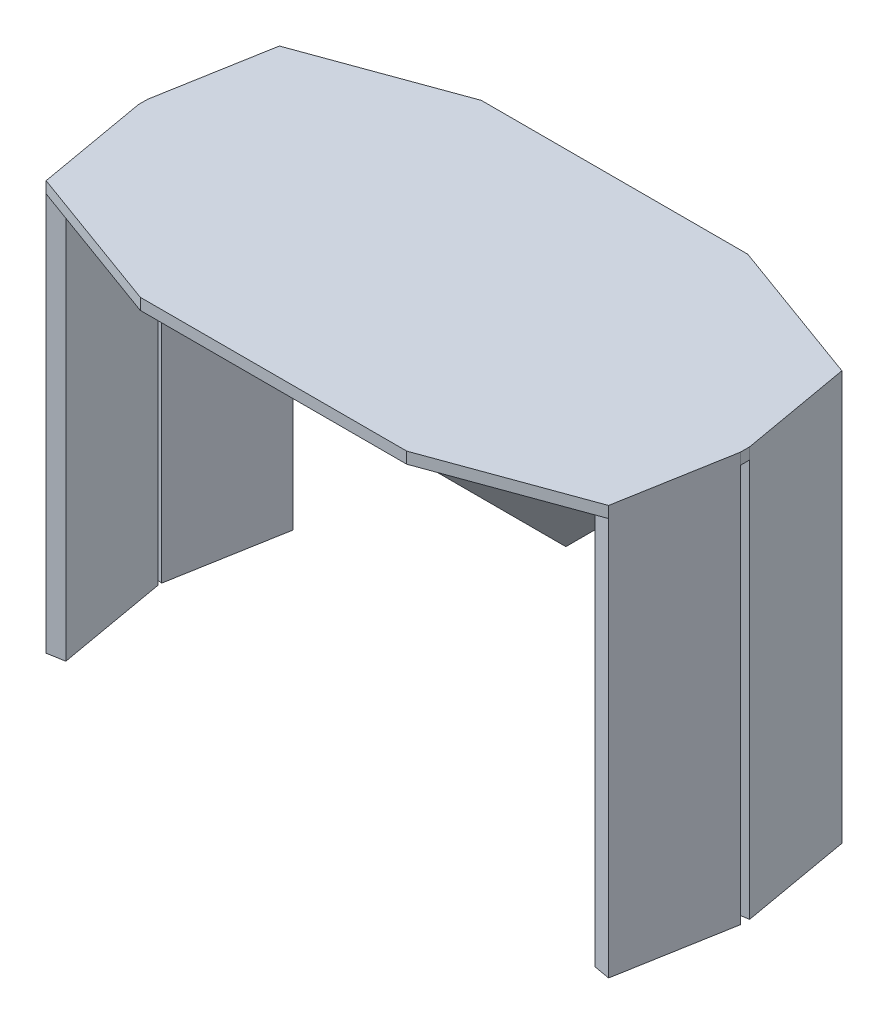
ISO-10303-21;
HEADER;
FILE_DESCRIPTION(('STEP AP214'),'2;1');
FILE_NAME('part.step','',(''),(''),'','','');
FILE_SCHEMA(('AUTOMOTIVE_DESIGN { 1 0 10303 214 1 1 1 1 }'));
ENDSEC;
DATA;
#1=APPLICATION_CONTEXT('core data for automotive mechanical design processes');
#2=APPLICATION_PROTOCOL_DEFINITION('international standard','automotive_design',2000,#1);
#3=PRODUCT_CONTEXT('',#1,'mechanical');
#4=PRODUCT('Part','Part','',(#3));
#5=PRODUCT_RELATED_PRODUCT_CATEGORY('part','',(#4));
#6=PRODUCT_DEFINITION_FORMATION('','',#4);
#7=PRODUCT_DEFINITION_CONTEXT('part definition',#1,'design');
#8=PRODUCT_DEFINITION('design','',#6,#7);
#9=PRODUCT_DEFINITION_SHAPE('','',#8);
#10=(LENGTH_UNIT() NAMED_UNIT(*) SI_UNIT(.MILLI.,.METRE.));
#11=(NAMED_UNIT(*) PLANE_ANGLE_UNIT() SI_UNIT($,.RADIAN.));
#12=(NAMED_UNIT(*) SI_UNIT($,.STERADIAN.) SOLID_ANGLE_UNIT());
#13=UNCERTAINTY_MEASURE_WITH_UNIT(LENGTH_MEASURE(1.E-05),#10,'distance_accuracy_value','');
#14=(GEOMETRIC_REPRESENTATION_CONTEXT(3) GLOBAL_UNCERTAINTY_ASSIGNED_CONTEXT((#13)) GLOBAL_UNIT_ASSIGNED_CONTEXT((#10,
#11,#12)) REPRESENTATION_CONTEXT('',''));
#15=CARTESIAN_POINT('',(0.,0.,0.));
#16=DIRECTION('',(0.,0.,1.));
#17=DIRECTION('',(1.,0.,0.));
#18=AXIS2_PLACEMENT_3D('',#15,#16,#17);
#19=CARTESIAN_POINT('',(3.47296355333847,-41.437039865158,-20.));
#20=DIRECTION('',(0.984807753012209,0.,0.173648177666924));
#21=DIRECTION('',(0.173648177666924,0.,-0.984807753012209));
#22=AXIS2_PLACEMENT_3D('',#19,#20,#21);
#23=PLANE('',#22);
#24=DIRECTION('',(0.,1.,0.));
#25=VECTOR('',#24,1.);
#26=CARTESIAN_POINT('',(3.47296355333847,-41.437039865158,-20.));
#27=LINE('',#26,#25);
#28=CARTESIAN_POINT('',(3.47296355333847,-41.437039865158,-20.));
#29=VERTEX_POINT('',#28);
#30=CARTESIAN_POINT('',(3.47296355333847,28.562960134842,-20.));
#31=VERTEX_POINT('',#30);
#32=EDGE_CURVE('E49',#29,#31,#27,.T.);
#33=ORIENTED_EDGE('',*,*,#32,.T.);
#34=DIRECTION('',(0.100623686125547,0.814994484643548,-0.570665281746756));
#35=VECTOR('',#34,1.);
#36=CARTESIAN_POINT('',(0.959479024496279,8.20516857384306,-5.74532088768638));
#37=LINE('',#36,#35);
#38=CARTESIAN_POINT('',(3.09129529284178,25.4716648420002,-17.8354517331199));
#39=VERTEX_POINT('',#38);
#40=EDGE_CURVE('E436',#39,#31,#37,.T.);
#41=ORIENTED_EDGE('',*,*,#40,.F.);
#42=DIRECTION('',(-0.171087869746029,0.171087869746031,0.970287525247816));
#43=VECTOR('',#42,1.);
#44=CARTESIAN_POINT('',(0.836068096298262,27.7268920385437,-5.04542273425472));
#45=LINE('',#44,#43);
#46=CARTESIAN_POINT('',(0.,28.562960134842,-0.303844939755816));
#47=VERTEX_POINT('',#46);
#48=EDGE_CURVE('E552',#39,#47,#45,.T.);
#49=ORIENTED_EDGE('',*,*,#48,.T.);
#50=DIRECTION('',(0.,1.,0.));
#51=VECTOR('',#50,1.);
#52=CARTESIAN_POINT('',(0.,-41.437039865158,-0.303844939755821));
#53=LINE('',#52,#51);
#54=CARTESIAN_POINT('',(0.,-41.437039865158,-0.303844939755821));
#55=VERTEX_POINT('',#54);
#56=EDGE_CURVE('E11',#55,#47,#53,.T.);
#57=ORIENTED_EDGE('',*,*,#56,.F.);
#58=DIRECTION('',(0.173648177666924,0.,-0.984807753012209));
#59=VECTOR('',#58,1.);
#60=CARTESIAN_POINT('',(3.47296355333847,-41.437039865158,-20.));
#61=LINE('',#60,#59);
#62=EDGE_CURVE('E411',#55,#29,#61,.T.);
#63=ORIENTED_EDGE('',*,*,#62,.T.);
#64=EDGE_LOOP('',(#33,#41,#49,#57,#63));
#65=FACE_BOUND('',#64,.T.);
#66=ADVANCED_FACE('F46',(#65),#23,.T.);
#67=CARTESIAN_POINT('',(0.,28.562960134842,0.));
#68=DIRECTION('',(0.,-1.,0.));
#69=DIRECTION('',(0.,0.,-1.));
#70=AXIS2_PLACEMENT_3D('',#67,#68,#69);
#71=PLANE('',#70);
#72=DIRECTION('',(0.984807753012209,0.,-0.173648177666924));
#73=VECTOR('',#72,1.);
#74=CARTESIAN_POINT('',(3.47296355333847,28.562960134842,20.));
#75=LINE('',#74,#73);
#76=CARTESIAN_POINT('',(0.518540294301844,28.562960134842,20.5209445330008));
#77=VERTEX_POINT('',#76);
#78=CARTESIAN_POINT('',(3.47296355333847,28.562960134842,20.));
#79=VERTEX_POINT('',#78);
#80=EDGE_CURVE('E513',#77,#79,#75,.T.);
#81=ORIENTED_EDGE('',*,*,#80,.T.);
#82=DIRECTION('',(-1.,0.,0.));
#83=VECTOR('',#82,1.);
#84=CARTESIAN_POINT('',(100.,28.562960134842,20.));
#85=LINE('',#84,#83);
#86=CARTESIAN_POINT('',(96.5270364466614,28.562960134842,20.));
#87=VERTEX_POINT('',#86);
#88=EDGE_CURVE('E261',#87,#79,#85,.T.);
#89=ORIENTED_EDGE('',*,*,#88,.F.);
#90=DIRECTION('',(0.984807753012209,0.,0.173648177666923));
#91=VECTOR('',#90,1.);
#92=CARTESIAN_POINT('',(96.5270364466614,28.562960134842,20.));
#93=LINE('',#92,#91);
#94=CARTESIAN_POINT('',(99.481459705698,28.562960134842,20.5209445330008));
#95=VERTEX_POINT('',#94);
#96=EDGE_CURVE('E473',#87,#95,#93,.T.);
#97=ORIENTED_EDGE('',*,*,#96,.T.);
#98=DIRECTION('',(0.93969262078591,0.,-0.342020143325663));
#99=VECTOR('',#98,1.);
#100=CARTESIAN_POINT('',(99.481459705698,28.562960134842,20.5209445330008));
#101=LINE('',#100,#99);
#102=CARTESIAN_POINT('',(73.4379688523593,28.562960134842,30.));
#103=VERTEX_POINT('',#102);
#104=EDGE_CURVE('E350',#103,#95,#101,.T.);
#105=ORIENTED_EDGE('',*,*,#104,.F.);
#106=DIRECTION('',(1.,0.,0.));
#107=VECTOR('',#106,1.);
#108=CARTESIAN_POINT('',(73.4379688523593,28.562960134842,30.));
#109=LINE('',#108,#107);
#110=CARTESIAN_POINT('',(26.5620311476406,28.562960134842,30.));
#111=VERTEX_POINT('',#110);
#112=EDGE_CURVE('E347',#111,#103,#109,.T.);
#113=ORIENTED_EDGE('',*,*,#112,.F.);
#114=DIRECTION('',(0.93969262078591,0.,0.342020143325663));
#115=VECTOR('',#114,1.);
#116=CARTESIAN_POINT('',(26.5620311476406,28.562960134842,30.));
#117=LINE('',#116,#115);
#118=EDGE_CURVE('E344',#77,#111,#117,.T.);
#119=ORIENTED_EDGE('',*,*,#118,.F.);
#120=EDGE_LOOP('',(#81,#89,#97,#105,#113,#119));
#121=FACE_BOUND('',#120,.T.);
#122=ADVANCED_FACE('F608',(#121),#71,.T.);
#123=DIRECTION('',(-0.984807753012209,0.,0.173648177666923));
#124=VECTOR('',#123,1.);
#125=CARTESIAN_POINT('',(96.5270364466614,28.562960134842,-20.));
#126=LINE('',#125,#124);
#127=CARTESIAN_POINT('',(99.481459705698,28.562960134842,-20.5209445330008));
#128=VERTEX_POINT('',#127);
#129=CARTESIAN_POINT('',(96.5270364466614,28.562960134842,-20.));
#130=VERTEX_POINT('',#129);
#131=EDGE_CURVE('E279',#128,#130,#126,.T.);
#132=ORIENTED_EDGE('',*,*,#131,.T.);
#133=DIRECTION('',(-1.,0.,0.));
#134=VECTOR('',#133,1.);
#135=CARTESIAN_POINT('',(100.,28.562960134842,-20.));
#136=LINE('',#135,#134);
#137=EDGE_CURVE('E443',#130,#31,#136,.T.);
#138=ORIENTED_EDGE('',*,*,#137,.T.);
#139=DIRECTION('',(-0.984807753012209,0.,-0.173648177666924));
#140=VECTOR('',#139,1.);
#141=CARTESIAN_POINT('',(3.47296355333847,28.562960134842,-20.));
#142=LINE('',#141,#140);
#143=CARTESIAN_POINT('',(0.518540294301844,28.562960134842,-20.5209445330008));
#144=VERTEX_POINT('',#143);
#145=EDGE_CURVE('E410',#31,#144,#142,.T.);
#146=ORIENTED_EDGE('',*,*,#145,.T.);
#147=DIRECTION('',(-0.93969262078591,0.,0.342020143325663));
#148=VECTOR('',#147,1.);
#149=CARTESIAN_POINT('',(0.518540294301844,28.562960134842,-20.5209445330008));
#150=LINE('',#149,#148);
#151=CARTESIAN_POINT('',(26.5620311476406,28.562960134842,-30.));
#152=VERTEX_POINT('',#151);
#153=EDGE_CURVE('E307',#152,#144,#150,.T.);
#154=ORIENTED_EDGE('',*,*,#153,.F.);
#155=DIRECTION('',(-1.,0.,0.));
#156=VECTOR('',#155,1.);
#157=CARTESIAN_POINT('',(26.5620311476406,28.562960134842,-30.));
#158=LINE('',#157,#156);
#159=CARTESIAN_POINT('',(73.4379688523592,28.562960134842,-30.));
#160=VERTEX_POINT('',#159);
#161=EDGE_CURVE('E360',#160,#152,#158,.T.);
#162=ORIENTED_EDGE('',*,*,#161,.F.);
#163=DIRECTION('',(-0.939692620785911,0.,-0.342020143325663));
#164=VECTOR('',#163,1.);
#165=CARTESIAN_POINT('',(73.4379688523592,28.562960134842,-30.));
#166=LINE('',#165,#164);
#167=EDGE_CURVE('E357',#128,#160,#166,.T.);
#168=ORIENTED_EDGE('',*,*,#167,.F.);
#169=EDGE_LOOP('',(#132,#138,#146,#154,#162,#168));
#170=FACE_BOUND('',#169,.T.);
#171=ADVANCED_FACE('F441',(#170),#71,.T.);
#172=DIRECTION('',(-0.984807753012209,0.,-0.173648177666924));
#173=VECTOR('',#172,1.);
#174=CARTESIAN_POINT('',(102.954423259036,28.562960134842,0.824789472756611));
#175=LINE('',#174,#173);
#176=CARTESIAN_POINT('',(102.954423259036,28.562960134842,0.824789472756611));
#177=VERTEX_POINT('',#176);
#178=CARTESIAN_POINT('',(100.,28.562960134842,0.303844939755861));
#179=VERTEX_POINT('',#178);
#180=EDGE_CURVE('E258',#177,#179,#175,.T.);
#181=ORIENTED_EDGE('',*,*,#180,.T.);
#182=DIRECTION('',(0.,0.,1.));
#183=VECTOR('',#182,1.);
#184=CARTESIAN_POINT('',(100.,28.562960134842,-20.));
#185=LINE('',#184,#183);
#186=CARTESIAN_POINT('',(100.,28.562960134842,-0.303844939755851));
#187=VERTEX_POINT('',#186);
#188=EDGE_CURVE('E239',#187,#179,#185,.T.);
#189=ORIENTED_EDGE('',*,*,#188,.F.);
#190=DIRECTION('',(0.984807753012209,0.,-0.173648177666924));
#191=VECTOR('',#190,1.);
#192=CARTESIAN_POINT('',(102.954423259036,28.562960134842,-0.824789472756596));
#193=LINE('',#192,#191);
#194=CARTESIAN_POINT('',(102.954423259036,28.562960134842,-0.824789472756596));
#195=VERTEX_POINT('',#194);
#196=EDGE_CURVE('E255',#187,#195,#193,.T.);
#197=ORIENTED_EDGE('',*,*,#196,.T.);
#198=DIRECTION('',(0.,0.,-1.));
#199=VECTOR('',#198,1.);
#200=CARTESIAN_POINT('',(102.954423259036,28.562960134842,-0.824789472756596));
#201=LINE('',#200,#199);
#202=EDGE_CURVE('E354',#177,#195,#201,.T.);
#203=ORIENTED_EDGE('',*,*,#202,.F.);
#204=EDGE_LOOP('',(#181,#189,#197,#203));
#205=FACE_BOUND('',#204,.T.);
#206=ADVANCED_FACE('F252',(#205),#71,.T.);
#207=DIRECTION('',(0.984807753012209,0.,0.173648177666924));
#208=VECTOR('',#207,1.);
#209=CARTESIAN_POINT('',(-2.95442325903662,28.562960134842,-0.824789472756583));
#210=LINE('',#209,#208);
#211=CARTESIAN_POINT('',(-2.95442325903662,28.562960134842,-0.824789472756583));
#212=VERTEX_POINT('',#211);
#213=EDGE_CURVE('E415',#212,#47,#210,.T.);
#214=ORIENTED_EDGE('',*,*,#213,.T.);
#215=DIRECTION('',(0.,0.,1.));
#216=VECTOR('',#215,1.);
#217=CARTESIAN_POINT('',(0.,28.562960134842,-20.));
#218=LINE('',#217,#216);
#219=CARTESIAN_POINT('',(0.,28.562960134842,0.303844939755803));
#220=VERTEX_POINT('',#219);
#221=EDGE_CURVE('E262',#47,#220,#218,.T.);
#222=ORIENTED_EDGE('',*,*,#221,.T.);
#223=DIRECTION('',(-0.984807753012209,0.,0.173648177666924));
#224=VECTOR('',#223,1.);
#225=CARTESIAN_POINT('',(-2.95442325903662,28.562960134842,0.824789472756598));
#226=LINE('',#225,#224);
#227=CARTESIAN_POINT('',(-2.95442325903662,28.562960134842,0.824789472756598));
#228=VERTEX_POINT('',#227);
#229=EDGE_CURVE('E517',#220,#228,#226,.T.);
#230=ORIENTED_EDGE('',*,*,#229,.T.);
#231=DIRECTION('',(0.,0.,1.));
#232=VECTOR('',#231,1.);
#233=CARTESIAN_POINT('',(-2.95442325903662,28.562960134842,-0.824789472756583));
#234=LINE('',#233,#232);
#235=EDGE_CURVE('E285',#212,#228,#234,.T.);
#236=ORIENTED_EDGE('',*,*,#235,.F.);
#237=EDGE_LOOP('',(#214,#222,#230,#236));
#238=FACE_BOUND('',#237,.T.);
#239=ADVANCED_FACE('F650',(#238),#71,.T.);
#240=CARTESIAN_POINT('',(96.5270364466614,-41.437039865158,-20.));
#241=DIRECTION('',(-0.984807753012209,0.,0.173648177666924));
#242=DIRECTION('',(0.173648177666924,0.,0.984807753012209));
#243=AXIS2_PLACEMENT_3D('',#240,#241,#242);
#244=PLANE('',#243);
#245=DIRECTION('',(-0.171087869746037,-0.171087869746039,-0.970287525247813));
#246=VECTOR('',#245,1.);
#247=CARTESIAN_POINT('',(95.7926256720428,24.3555858068847,-24.1650504742258));
#248=LINE('',#247,#246);
#249=CARTESIAN_POINT('',(96.9087047071581,25.4716648420001,-17.8354517331199));
#250=VERTEX_POINT('',#249);
#251=EDGE_CURVE('E236',#187,#250,#248,.T.);
#252=ORIENTED_EDGE('',*,*,#251,.T.);
#253=DIRECTION('',(0.100623686125552,-0.814994484643548,0.570665281746756));
#254=VECTOR('',#253,1.);
#255=CARTESIAN_POINT('',(100.053033596453,0.00439365216062918,-0.00307646836314397));
#256=LINE('',#255,#254);
#257=EDGE_CURVE('E572',#130,#250,#256,.T.);
#258=ORIENTED_EDGE('',*,*,#257,.F.);
#259=DIRECTION('',(0.,1.,0.));
#260=VECTOR('',#259,1.);
#261=CARTESIAN_POINT('',(96.5270364466614,-41.437039865158,-20.));
#262=LINE('',#261,#260);
#263=CARTESIAN_POINT('',(96.5270364466614,-41.437039865158,-20.));
#264=VERTEX_POINT('',#263);
#265=EDGE_CURVE('E273',#264,#130,#262,.T.);
#266=ORIENTED_EDGE('',*,*,#265,.F.);
#267=DIRECTION('',(0.173648177666924,0.,0.984807753012209));
#268=VECTOR('',#267,1.);
#269=CARTESIAN_POINT('',(96.5270364466614,-41.437039865158,-20.));
#270=LINE('',#269,#268);
#271=CARTESIAN_POINT('',(99.9999999999998,-41.437039865158,-0.303844939755833));
#272=VERTEX_POINT('',#271);
#273=EDGE_CURVE('E268',#264,#272,#270,.T.);
#274=ORIENTED_EDGE('',*,*,#273,.T.);
#275=DIRECTION('',(0.,1.,0.));
#276=VECTOR('',#275,1.);
#277=CARTESIAN_POINT('',(99.9999999999998,-41.437039865158,-0.303844939755833));
#278=LINE('',#277,#276);
#279=EDGE_CURVE('E265',#272,#187,#278,.T.);
#280=ORIENTED_EDGE('',*,*,#279,.T.);
#281=EDGE_LOOP('',(#252,#258,#266,#274,#280));
#282=FACE_BOUND('',#281,.T.);
#283=ADVANCED_FACE('F266',(#282),#244,.T.);
#284=CARTESIAN_POINT('',(96.5270364466614,-41.437039865158,20.));
#285=DIRECTION('',(-0.984807753012209,0.,-0.173648177666924));
#286=DIRECTION('',(-0.173648177666924,0.,0.984807753012209));
#287=AXIS2_PLACEMENT_3D('',#284,#285,#286);
#288=PLANE('',#287);
#289=DIRECTION('',(0.,1.,0.));
#290=VECTOR('',#289,1.);
#291=CARTESIAN_POINT('',(96.5270364466614,-41.437039865158,20.));
#292=LINE('',#291,#290);
#293=CARTESIAN_POINT('',(96.5270364466614,-41.437039865158,20.));
#294=VERTEX_POINT('',#293);
#295=EDGE_CURVE('E498',#294,#87,#292,.T.);
#296=ORIENTED_EDGE('',*,*,#295,.T.);
#297=DIRECTION('',(-0.100623686125552,0.814994484643548,0.570665281746756));
#298=VECTOR('',#297,1.);
#299=CARTESIAN_POINT('',(96.5622006409599,28.2781502107206,19.8005739441733));
#300=LINE('',#299,#298);
#301=CARTESIAN_POINT('',(96.9087047071581,25.471664842,17.8354517331199));
#302=VERTEX_POINT('',#301);
#303=EDGE_CURVE('E569',#302,#87,#300,.T.);
#304=ORIENTED_EDGE('',*,*,#303,.F.);
#305=DIRECTION('',(0.171087869746037,0.171087869746039,-0.970287525247813));
#306=VECTOR('',#305,1.);
#307=CARTESIAN_POINT('',(95.7926256720428,24.3555858068847,24.1650504742258));
#308=LINE('',#307,#306);
#309=EDGE_CURVE('E555',#302,#179,#308,.T.);
#310=ORIENTED_EDGE('',*,*,#309,.T.);
#311=DIRECTION('',(0.,1.,0.));
#312=VECTOR('',#311,1.);
#313=CARTESIAN_POINT('',(99.9999999999998,-41.437039865158,0.303844939755832));
#314=LINE('',#313,#312);
#315=CARTESIAN_POINT('',(99.9999999999998,-41.437039865158,0.303844939755832));
#316=VERTEX_POINT('',#315);
#317=EDGE_CURVE('E510',#316,#179,#314,.T.);
#318=ORIENTED_EDGE('',*,*,#317,.F.);
#319=DIRECTION('',(-0.173648177666924,0.,0.984807753012209));
#320=VECTOR('',#319,1.);
#321=CARTESIAN_POINT('',(96.5270364466614,-41.437039865158,20.));
#322=LINE('',#321,#320);
#323=EDGE_CURVE('E478',#316,#294,#322,.T.);
#324=ORIENTED_EDGE('',*,*,#323,.T.);
#325=EDGE_LOOP('',(#296,#304,#310,#318,#324));
#326=FACE_BOUND('',#325,.T.);
#327=ADVANCED_FACE('F600',(#326),#288,.T.);
#328=CARTESIAN_POINT('',(3.47296355333847,-41.437039865158,20.));
#329=DIRECTION('',(0.984807753012209,0.,-0.173648177666924));
#330=DIRECTION('',(-0.173648177666924,0.,-0.984807753012209));
#331=AXIS2_PLACEMENT_3D('',#328,#329,#330);
#332=PLANE('',#331);
#333=DIRECTION('',(0.171087869746029,-0.171087869746031,0.970287525247816));
#334=VECTOR('',#333,1.);
#335=CARTESIAN_POINT('',(0.83606809629826,27.7268920385437,5.04542273425473));
#336=LINE('',#335,#334);
#337=CARTESIAN_POINT('',(3.09129529284178,25.4716648420002,17.83545173312));
#338=VERTEX_POINT('',#337);
#339=EDGE_CURVE('E579',#220,#338,#336,.T.);
#340=ORIENTED_EDGE('',*,*,#339,.T.);
#341=DIRECTION('',(-0.100623686125547,-0.814994484643548,-0.570665281746756));
#342=VECTOR('',#341,1.);
#343=CARTESIAN_POINT('',(4.4503119799892,36.4789251324031,25.5428183634965));
#344=LINE('',#343,#342);
#345=EDGE_CURVE('E63',#79,#338,#344,.T.);
#346=ORIENTED_EDGE('',*,*,#345,.F.);
#347=DIRECTION('',(0.,1.,0.));
#348=VECTOR('',#347,1.);
#349=CARTESIAN_POINT('',(3.47296355333847,-41.437039865158,20.));
#350=LINE('',#349,#348);
#351=CARTESIAN_POINT('',(3.47296355333847,-41.437039865158,20.));
#352=VERTEX_POINT('',#351);
#353=EDGE_CURVE('E536',#352,#79,#350,.T.);
#354=ORIENTED_EDGE('',*,*,#353,.F.);
#355=DIRECTION('',(-0.173648177666924,0.,-0.984807753012209));
#356=VECTOR('',#355,1.);
#357=CARTESIAN_POINT('',(3.47296355333847,-41.437039865158,20.));
#358=LINE('',#357,#356);
#359=CARTESIAN_POINT('',(0.,-41.437039865158,0.30384493975582));
#360=VERTEX_POINT('',#359);
#361=EDGE_CURVE('E524',#352,#360,#358,.T.);
#362=ORIENTED_EDGE('',*,*,#361,.T.);
#363=DIRECTION('',(0.,1.,0.));
#364=VECTOR('',#363,1.);
#365=CARTESIAN_POINT('',(0.,-41.437039865158,0.30384493975582));
#366=LINE('',#365,#364);
#367=EDGE_CURVE('E540',#360,#220,#366,.T.);
#368=ORIENTED_EDGE('',*,*,#367,.T.);
#369=EDGE_LOOP('',(#340,#346,#354,#362,#368));
#370=FACE_BOUND('',#369,.T.);
#371=ADVANCED_FACE('F640',(#370),#332,.T.);
#372=CARTESIAN_POINT('',(-2.95442325903662,-41.437039865158,-0.824789472756591));
#373=DIRECTION('',(-0.173648177666924,0.,0.984807753012209));
#374=DIRECTION('',(0.984807753012209,0.,0.173648177666924));
#375=AXIS2_PLACEMENT_3D('',#372,#373,#374);
#376=PLANE('',#375);
#377=ORIENTED_EDGE('',*,*,#213,.F.);
#378=DIRECTION('',(0.,1.,0.));
#379=VECTOR('',#378,1.);
#380=CARTESIAN_POINT('',(-2.95442325903662,-41.437039865158,-0.824789472756591));
#381=LINE('',#380,#379);
#382=CARTESIAN_POINT('',(-2.95442325903662,-41.437039865158,-0.824789472756591));
#383=VERTEX_POINT('',#382);
#384=EDGE_CURVE('E55',#383,#212,#381,.T.);
#385=ORIENTED_EDGE('',*,*,#384,.F.);
#386=DIRECTION('',(0.984807753012209,0.,0.173648177666924));
#387=VECTOR('',#386,1.);
#388=CARTESIAN_POINT('',(-2.95442325903662,-41.437039865158,-0.824789472756591));
#389=LINE('',#388,#387);
#390=EDGE_CURVE('E421',#383,#55,#389,.T.);
#391=ORIENTED_EDGE('',*,*,#390,.T.);
#392=ORIENTED_EDGE('',*,*,#56,.T.);
#393=EDGE_LOOP('',(#377,#385,#391,#392));
#394=FACE_BOUND('',#393,.T.);
#395=ADVANCED_FACE('F653',(#394),#376,.T.);
#396=CARTESIAN_POINT('',(0.518540294301844,-41.437039865158,-20.5209445330008));
#397=DIRECTION('',(-0.984807753012209,0.,-0.173648177666923));
#398=DIRECTION('',(-0.173648177666923,0.,0.984807753012209));
#399=AXIS2_PLACEMENT_3D('',#396,#397,#398);
#400=PLANE('',#399);
#401=ORIENTED_EDGE('',*,*,#384,.T.);
#402=DIRECTION('',(0.,-1.,0.));
#403=VECTOR('',#402,1.);
#404=CARTESIAN_POINT('',(-2.95442325903662,30.562960134842,-0.824789472756582));
#405=LINE('',#404,#403);
#406=CARTESIAN_POINT('',(-2.95442325903662,30.562960134842,-0.824789472756582));
#407=VERTEX_POINT('',#406);
#408=EDGE_CURVE('E406',#407,#212,#405,.T.);
#409=ORIENTED_EDGE('',*,*,#408,.F.);
#410=DIRECTION('',(-0.173648177666923,0.,0.984807753012209));
#411=VECTOR('',#410,1.);
#412=CARTESIAN_POINT('',(0.518540294301844,30.562960134842,-20.5209445330008));
#413=LINE('',#412,#411);
#414=CARTESIAN_POINT('',(0.518540294301844,30.562960134842,-20.5209445330008));
#415=VERTEX_POINT('',#414);
#416=EDGE_CURVE('E302',#415,#407,#413,.T.);
#417=ORIENTED_EDGE('',*,*,#416,.F.);
#418=DIRECTION('',(0.,-1.,0.));
#419=VECTOR('',#418,1.);
#420=CARTESIAN_POINT('',(0.518540294301844,30.562960134842,-20.5209445330008));
#421=LINE('',#420,#419);
#422=EDGE_CURVE('E340',#415,#144,#421,.T.);
#423=ORIENTED_EDGE('',*,*,#422,.T.);
#424=DIRECTION('',(0.,1.,0.));
#425=VECTOR('',#424,1.);
#426=CARTESIAN_POINT('',(0.518540294301844,-41.437039865158,-20.5209445330008));
#427=LINE('',#426,#425);
#428=CARTESIAN_POINT('',(0.518540294301844,-41.437039865158,-20.5209445330008));
#429=VERTEX_POINT('',#428);
#430=EDGE_CURVE('E432',#429,#144,#427,.T.);
#431=ORIENTED_EDGE('',*,*,#430,.F.);
#432=DIRECTION('',(-0.173648177666923,0.,0.984807753012209));
#433=VECTOR('',#432,1.);
#434=CARTESIAN_POINT('',(0.518540294301844,-41.437039865158,-20.5209445330008));
#435=LINE('',#434,#433);
#436=EDGE_CURVE('E418',#429,#383,#435,.T.);
#437=ORIENTED_EDGE('',*,*,#436,.T.);
#438=EDGE_LOOP('',(#401,#409,#417,#423,#431,#437));
#439=FACE_BOUND('',#438,.T.);
#440=ADVANCED_FACE('F450',(#439),#400,.T.);
#441=CARTESIAN_POINT('',(3.47296355333847,-41.437039865158,-20.));
#442=DIRECTION('',(0.173648177666924,0.,-0.984807753012209));
#443=DIRECTION('',(-0.984807753012209,0.,-0.173648177666924));
#444=AXIS2_PLACEMENT_3D('',#441,#442,#443);
#445=PLANE('',#444);
#446=ORIENTED_EDGE('',*,*,#145,.F.);
#447=ORIENTED_EDGE('',*,*,#32,.F.);
#448=DIRECTION('',(-0.984807753012209,0.,-0.173648177666924));
#449=VECTOR('',#448,1.);
#450=CARTESIAN_POINT('',(3.47296355333847,-41.437039865158,-20.));
#451=LINE('',#450,#449);
#452=EDGE_CURVE('E414',#29,#429,#451,.T.);
#453=ORIENTED_EDGE('',*,*,#452,.T.);
#454=ORIENTED_EDGE('',*,*,#430,.T.);
#455=EDGE_LOOP('',(#446,#447,#453,#454));
#456=FACE_BOUND('',#455,.T.);
#457=ADVANCED_FACE('F437',(#456),#445,.T.);
#458=CARTESIAN_POINT('',(0.,-41.437039865158,0.));
#459=DIRECTION('',(0.,1.,0.));
#460=DIRECTION('',(0.,0.,1.));
#461=AXIS2_PLACEMENT_3D('',#458,#459,#460);
#462=PLANE('',#461);
#463=ORIENTED_EDGE('',*,*,#62,.F.);
#464=ORIENTED_EDGE('',*,*,#390,.F.);
#465=ORIENTED_EDGE('',*,*,#436,.F.);
#466=ORIENTED_EDGE('',*,*,#452,.F.);
#467=EDGE_LOOP('',(#463,#464,#465,#466));
#468=FACE_BOUND('',#467,.T.);
#469=ADVANCED_FACE('F656',(#468),#462,.F.);
#470=CARTESIAN_POINT('',(-2.95442325903662,30.562960134842,-0.824789472756582));
#471=DIRECTION('',(1.,0.,0.));
#472=DIRECTION('',(0.,0.,-1.));
#473=AXIS2_PLACEMENT_3D('',#470,#471,#472);
#474=PLANE('',#473);
#475=ORIENTED_EDGE('',*,*,#235,.T.);
#476=DIRECTION('',(0.,-1.,0.));
#477=VECTOR('',#476,1.);
#478=CARTESIAN_POINT('',(-2.95442325903662,30.562960134842,0.824789472756598));
#479=LINE('',#478,#477);
#480=CARTESIAN_POINT('',(-2.95442325903662,30.562960134842,0.824789472756598));
#481=VERTEX_POINT('',#480);
#482=EDGE_CURVE('E402',#481,#228,#479,.T.);
#483=ORIENTED_EDGE('',*,*,#482,.F.);
#484=DIRECTION('',(0.,0.,1.));
#485=VECTOR('',#484,1.);
#486=CARTESIAN_POINT('',(-2.95442325903662,30.562960134842,-0.824789472756582));
#487=LINE('',#486,#485);
#488=EDGE_CURVE('E306',#407,#481,#487,.T.);
#489=ORIENTED_EDGE('',*,*,#488,.F.);
#490=ORIENTED_EDGE('',*,*,#408,.T.);
#491=EDGE_LOOP('',(#475,#483,#489,#490));
#492=FACE_BOUND('',#491,.T.);
#493=ADVANCED_FACE('F658',(#492),#474,.F.);
#494=CARTESIAN_POINT('',(-2.95442325903662,30.562960134842,0.824789472756598));
#495=DIRECTION('',(0.984807753012209,0.,-0.173648177666923));
#496=DIRECTION('',(-0.173648177666923,0.,-0.984807753012209));
#497=AXIS2_PLACEMENT_3D('',#494,#495,#496);
#498=PLANE('',#497);
#499=ORIENTED_EDGE('',*,*,#482,.T.);
#500=DIRECTION('',(0.,1.,0.));
#501=VECTOR('',#500,1.);
#502=CARTESIAN_POINT('',(-2.95442325903662,-41.437039865158,0.82478947275659));
#503=LINE('',#502,#501);
#504=CARTESIAN_POINT('',(-2.95442325903662,-41.437039865158,0.82478947275659));
#505=VERTEX_POINT('',#504);
#506=EDGE_CURVE('E544',#505,#228,#503,.T.);
#507=ORIENTED_EDGE('',*,*,#506,.F.);
#508=DIRECTION('',(0.173648177666923,0.,0.984807753012209));
#509=VECTOR('',#508,1.);
#510=CARTESIAN_POINT('',(0.518540294301844,-41.437039865158,20.5209445330008));
#511=LINE('',#510,#509);
#512=CARTESIAN_POINT('',(0.518540294301844,-41.437039865158,20.5209445330008));
#513=VERTEX_POINT('',#512);
#514=EDGE_CURVE('E532',#505,#513,#511,.T.);
#515=ORIENTED_EDGE('',*,*,#514,.T.);
#516=DIRECTION('',(0.,1.,0.));
#517=VECTOR('',#516,1.);
#518=CARTESIAN_POINT('',(0.518540294301844,-41.437039865158,20.5209445330008));
#519=LINE('',#518,#517);
#520=EDGE_CURVE('E548',#513,#77,#519,.T.);
#521=ORIENTED_EDGE('',*,*,#520,.T.);
#522=DIRECTION('',(0.,-1.,0.));
#523=VECTOR('',#522,1.);
#524=CARTESIAN_POINT('',(0.518540294301844,30.562960134842,20.5209445330008));
#525=LINE('',#524,#523);
#526=CARTESIAN_POINT('',(0.518540294301844,30.562960134842,20.5209445330008));
#527=VERTEX_POINT('',#526);
#528=EDGE_CURVE('E399',#527,#77,#525,.T.);
#529=ORIENTED_EDGE('',*,*,#528,.F.);
#530=DIRECTION('',(0.173648177666923,0.,0.984807753012209));
#531=VECTOR('',#530,1.);
#532=CARTESIAN_POINT('',(-2.95442325903662,30.562960134842,0.824789472756598));
#533=LINE('',#532,#531);
#534=EDGE_CURVE('E310',#481,#527,#533,.T.);
#535=ORIENTED_EDGE('',*,*,#534,.F.);
#536=EDGE_LOOP('',(#499,#507,#515,#521,#529,#535));
#537=FACE_BOUND('',#536,.T.);
#538=ADVANCED_FACE('F632',(#537),#498,.F.);
#539=CARTESIAN_POINT('',(26.5620311476406,30.562960134842,30.));
#540=DIRECTION('',(0.342020143325663,0.,-0.939692620785911));
#541=DIRECTION('',(-0.939692620785911,0.,-0.342020143325663));
#542=AXIS2_PLACEMENT_3D('',#539,#540,#541);
#543=PLANE('',#542);
#544=ORIENTED_EDGE('',*,*,#118,.T.);
#545=DIRECTION('',(0.,-1.,0.));
#546=VECTOR('',#545,1.);
#547=CARTESIAN_POINT('',(26.5620311476406,30.562960134842,30.));
#548=LINE('',#547,#546);
#549=CARTESIAN_POINT('',(26.5620311476406,30.562960134842,30.));
#550=VERTEX_POINT('',#549);
#551=EDGE_CURVE('E395',#550,#111,#548,.T.);
#552=ORIENTED_EDGE('',*,*,#551,.F.);
#553=DIRECTION('',(0.93969262078591,0.,0.342020143325663));
#554=VECTOR('',#553,1.);
#555=CARTESIAN_POINT('',(26.5620311476406,30.562960134842,30.));
#556=LINE('',#555,#554);
#557=EDGE_CURVE('E313',#527,#550,#556,.T.);
#558=ORIENTED_EDGE('',*,*,#557,.F.);
#559=ORIENTED_EDGE('',*,*,#528,.T.);
#560=EDGE_LOOP('',(#544,#552,#558,#559));
#561=FACE_BOUND('',#560,.T.);
#562=ADVANCED_FACE('F729',(#561),#543,.F.);
#563=CARTESIAN_POINT('',(73.4379688523593,30.562960134842,30.));
#564=DIRECTION('',(0.,0.,-1.));
#565=DIRECTION('',(0.,1.,0.));
#566=AXIS2_PLACEMENT_3D('',#563,#564,#565);
#567=PLANE('',#566);
#568=ORIENTED_EDGE('',*,*,#112,.T.);
#569=DIRECTION('',(0.,-1.,0.));
#570=VECTOR('',#569,1.);
#571=CARTESIAN_POINT('',(73.4379688523593,30.562960134842,30.));
#572=LINE('',#571,#570);
#573=CARTESIAN_POINT('',(73.4379688523593,30.562960134842,30.));
#574=VERTEX_POINT('',#573);
#575=EDGE_CURVE('E391',#574,#103,#572,.T.);
#576=ORIENTED_EDGE('',*,*,#575,.F.);
#577=DIRECTION('',(1.,0.,0.));
#578=VECTOR('',#577,1.);
#579=CARTESIAN_POINT('',(73.4379688523593,30.562960134842,30.));
#580=LINE('',#579,#578);
#581=EDGE_CURVE('E316',#550,#574,#580,.T.);
#582=ORIENTED_EDGE('',*,*,#581,.F.);
#583=ORIENTED_EDGE('',*,*,#551,.T.);
#584=EDGE_LOOP('',(#568,#576,#582,#583));
#585=FACE_BOUND('',#584,.T.);
#586=ADVANCED_FACE('F626',(#585),#567,.F.);
#587=CARTESIAN_POINT('',(99.481459705698,30.562960134842,20.5209445330008));
#588=DIRECTION('',(-0.342020143325663,0.,-0.93969262078591));
#589=DIRECTION('',(-0.93969262078591,0.,0.342020143325663));
#590=AXIS2_PLACEMENT_3D('',#587,#588,#589);
#591=PLANE('',#590);
#592=ORIENTED_EDGE('',*,*,#104,.T.);
#593=DIRECTION('',(0.,-1.,0.));
#594=VECTOR('',#593,1.);
#595=CARTESIAN_POINT('',(99.481459705698,30.562960134842,20.5209445330008));
#596=LINE('',#595,#594);
#597=CARTESIAN_POINT('',(99.481459705698,30.562960134842,20.5209445330008));
#598=VERTEX_POINT('',#597);
#599=EDGE_CURVE('E387',#598,#95,#596,.T.);
#600=ORIENTED_EDGE('',*,*,#599,.F.);
#601=DIRECTION('',(0.93969262078591,0.,-0.342020143325663));
#602=VECTOR('',#601,1.);
#603=CARTESIAN_POINT('',(99.481459705698,30.562960134842,20.5209445330008));
#604=LINE('',#603,#602);
#605=EDGE_CURVE('E319',#574,#598,#604,.T.);
#606=ORIENTED_EDGE('',*,*,#605,.F.);
#607=ORIENTED_EDGE('',*,*,#575,.T.);
#608=EDGE_LOOP('',(#592,#600,#606,#607));
#609=FACE_BOUND('',#608,.T.);
#610=ADVANCED_FACE('F612',(#609),#591,.F.);
#611=CARTESIAN_POINT('',(102.954423259036,30.562960134842,0.824789472756611));
#612=DIRECTION('',(-0.984807753012209,0.,-0.173648177666923));
#613=DIRECTION('',(-0.173648177666923,0.,0.984807753012209));
#614=AXIS2_PLACEMENT_3D('',#611,#612,#613);
#615=PLANE('',#614);
#616=ORIENTED_EDGE('',*,*,#599,.T.);
#617=DIRECTION('',(0.,1.,0.));
#618=VECTOR('',#617,1.);
#619=CARTESIAN_POINT('',(99.481459705698,-41.437039865158,20.5209445330008));
#620=LINE('',#619,#618);
#621=CARTESIAN_POINT('',(99.481459705698,-41.437039865158,20.5209445330008));
#622=VERTEX_POINT('',#621);
#623=EDGE_CURVE('E502',#622,#95,#620,.T.);
#624=ORIENTED_EDGE('',*,*,#623,.F.);
#625=DIRECTION('',(0.173648177666923,0.,-0.984807753012209));
#626=VECTOR('',#625,1.);
#627=CARTESIAN_POINT('',(99.481459705698,-41.437039865158,20.5209445330008));
#628=LINE('',#627,#626);
#629=CARTESIAN_POINT('',(102.954423259036,-41.437039865158,0.824789472756603));
#630=VERTEX_POINT('',#629);
#631=EDGE_CURVE('E491',#622,#630,#628,.T.);
#632=ORIENTED_EDGE('',*,*,#631,.T.);
#633=DIRECTION('',(0.,1.,0.));
#634=VECTOR('',#633,1.);
#635=CARTESIAN_POINT('',(102.954423259036,-41.437039865158,0.824789472756603));
#636=LINE('',#635,#634);
#637=EDGE_CURVE('E506',#630,#177,#636,.T.);
#638=ORIENTED_EDGE('',*,*,#637,.T.);
#639=DIRECTION('',(0.,-1.,0.));
#640=VECTOR('',#639,1.);
#641=CARTESIAN_POINT('',(102.954423259036,30.562960134842,0.824789472756611));
#642=LINE('',#641,#640);
#643=CARTESIAN_POINT('',(102.954423259036,30.562960134842,0.824789472756611));
#644=VERTEX_POINT('',#643);
#645=EDGE_CURVE('E384',#644,#177,#642,.T.);
#646=ORIENTED_EDGE('',*,*,#645,.F.);
#647=DIRECTION('',(0.173648177666923,0.,-0.984807753012209));
#648=VECTOR('',#647,1.);
#649=CARTESIAN_POINT('',(102.954423259036,30.562960134842,0.824789472756611));
#650=LINE('',#649,#648);
#651=EDGE_CURVE('E322',#598,#644,#650,.T.);
#652=ORIENTED_EDGE('',*,*,#651,.F.);
#653=EDGE_LOOP('',(#616,#624,#632,#638,#646,#652));
#654=FACE_BOUND('',#653,.T.);
#655=ADVANCED_FACE('F617',(#654),#615,.F.);
#656=CARTESIAN_POINT('',(102.954423259036,30.562960134842,-0.824789472756595));
#657=DIRECTION('',(-1.,0.,0.));
#658=DIRECTION('',(0.,0.,1.));
#659=AXIS2_PLACEMENT_3D('',#656,#657,#658);
#660=PLANE('',#659);
#661=ORIENTED_EDGE('',*,*,#202,.T.);
#662=DIRECTION('',(0.,-1.,0.));
#663=VECTOR('',#662,1.);
#664=CARTESIAN_POINT('',(102.954423259036,30.562960134842,-0.824789472756595));
#665=LINE('',#664,#663);
#666=CARTESIAN_POINT('',(102.954423259036,30.562960134842,-0.824789472756595));
#667=VERTEX_POINT('',#666);
#668=EDGE_CURVE('E380',#667,#195,#665,.T.);
#669=ORIENTED_EDGE('',*,*,#668,.F.);
#670=DIRECTION('',(0.,0.,-1.));
#671=VECTOR('',#670,1.);
#672=CARTESIAN_POINT('',(102.954423259036,30.562960134842,-0.824789472756595));
#673=LINE('',#672,#671);
#674=EDGE_CURVE('E325',#644,#667,#673,.T.);
#675=ORIENTED_EDGE('',*,*,#674,.F.);
#676=ORIENTED_EDGE('',*,*,#645,.T.);
#677=EDGE_LOOP('',(#661,#669,#675,#676));
#678=FACE_BOUND('',#677,.T.);
#679=ADVANCED_FACE('F762',(#678),#660,.F.);
#680=CARTESIAN_POINT('',(99.481459705698,30.562960134842,-20.5209445330008));
#681=DIRECTION('',(-0.984807753012209,0.,0.173648177666923));
#682=DIRECTION('',(0.173648177666923,0.,0.984807753012209));
#683=AXIS2_PLACEMENT_3D('',#680,#681,#682);
#684=PLANE('',#683);
#685=ORIENTED_EDGE('',*,*,#668,.T.);
#686=DIRECTION('',(0.,1.,0.));
#687=VECTOR('',#686,1.);
#688=CARTESIAN_POINT('',(102.954423259036,-41.437039865158,-0.824789472756604));
#689=LINE('',#688,#687);
#690=CARTESIAN_POINT('',(102.954423259036,-41.437039865158,-0.824789472756604));
#691=VERTEX_POINT('',#690);
#692=EDGE_CURVE('E274',#691,#195,#689,.T.);
#693=ORIENTED_EDGE('',*,*,#692,.F.);
#694=DIRECTION('',(-0.173648177666923,0.,-0.984807753012209));
#695=VECTOR('',#694,1.);
#696=CARTESIAN_POINT('',(99.481459705698,-41.437039865158,-20.5209445330008));
#697=LINE('',#696,#695);
#698=CARTESIAN_POINT('',(99.481459705698,-41.437039865158,-20.5209445330008));
#699=VERTEX_POINT('',#698);
#700=EDGE_CURVE('E293',#691,#699,#697,.T.);
#701=ORIENTED_EDGE('',*,*,#700,.T.);
#702=DIRECTION('',(0.,1.,0.));
#703=VECTOR('',#702,1.);
#704=CARTESIAN_POINT('',(99.481459705698,-41.437039865158,-20.5209445330008));
#705=LINE('',#704,#703);
#706=EDGE_CURVE('E290',#699,#128,#705,.T.);
#707=ORIENTED_EDGE('',*,*,#706,.T.);
#708=DIRECTION('',(0.,-1.,0.));
#709=VECTOR('',#708,1.);
#710=CARTESIAN_POINT('',(99.481459705698,30.562960134842,-20.5209445330008));
#711=LINE('',#710,#709);
#712=CARTESIAN_POINT('',(99.481459705698,30.562960134842,-20.5209445330008));
#713=VERTEX_POINT('',#712);
#714=EDGE_CURVE('E377',#713,#128,#711,.T.);
#715=ORIENTED_EDGE('',*,*,#714,.F.);
#716=DIRECTION('',(-0.173648177666923,0.,-0.984807753012209));
#717=VECTOR('',#716,1.);
#718=CARTESIAN_POINT('',(99.481459705698,30.562960134842,-20.5209445330008));
#719=LINE('',#718,#717);
#720=EDGE_CURVE('E328',#667,#713,#719,.T.);
#721=ORIENTED_EDGE('',*,*,#720,.F.);
#722=EDGE_LOOP('',(#685,#693,#701,#707,#715,#721));
#723=FACE_BOUND('',#722,.T.);
#724=ADVANCED_FACE('F467',(#723),#684,.F.);
#725=CARTESIAN_POINT('',(73.4379688523592,30.562960134842,-30.));
#726=DIRECTION('',(-0.342020143325663,0.,0.939692620785911));
#727=DIRECTION('',(0.939692620785911,0.,0.342020143325663));
#728=AXIS2_PLACEMENT_3D('',#725,#726,#727);
#729=PLANE('',#728);
#730=ORIENTED_EDGE('',*,*,#167,.T.);
#731=DIRECTION('',(0.,-1.,0.));
#732=VECTOR('',#731,1.);
#733=CARTESIAN_POINT('',(73.4379688523592,30.562960134842,-30.));
#734=LINE('',#733,#732);
#735=CARTESIAN_POINT('',(73.4379688523592,30.562960134842,-30.));
#736=VERTEX_POINT('',#735);
#737=EDGE_CURVE('E373',#736,#160,#734,.T.);
#738=ORIENTED_EDGE('',*,*,#737,.F.);
#739=DIRECTION('',(-0.939692620785911,0.,-0.342020143325663));
#740=VECTOR('',#739,1.);
#741=CARTESIAN_POINT('',(73.4379688523592,30.562960134842,-30.));
#742=LINE('',#741,#740);
#743=EDGE_CURVE('E331',#713,#736,#742,.T.);
#744=ORIENTED_EDGE('',*,*,#743,.F.);
#745=ORIENTED_EDGE('',*,*,#714,.T.);
#746=EDGE_LOOP('',(#730,#738,#744,#745));
#747=FACE_BOUND('',#746,.T.);
#748=ADVANCED_FACE('F780',(#747),#729,.F.);
#749=CARTESIAN_POINT('',(26.5620311476406,30.562960134842,-30.));
#750=DIRECTION('',(0.,0.,1.));
#751=DIRECTION('',(0.,-1.,0.));
#752=AXIS2_PLACEMENT_3D('',#749,#750,#751);
#753=PLANE('',#752);
#754=ORIENTED_EDGE('',*,*,#161,.T.);
#755=DIRECTION('',(0.,-1.,0.));
#756=VECTOR('',#755,1.);
#757=CARTESIAN_POINT('',(26.5620311476406,30.562960134842,-30.));
#758=LINE('',#757,#756);
#759=CARTESIAN_POINT('',(26.5620311476406,30.562960134842,-30.));
#760=VERTEX_POINT('',#759);
#761=EDGE_CURVE('E369',#760,#152,#758,.T.);
#762=ORIENTED_EDGE('',*,*,#761,.F.);
#763=DIRECTION('',(-1.,0.,0.));
#764=VECTOR('',#763,1.);
#765=CARTESIAN_POINT('',(26.5620311476406,30.562960134842,-30.));
#766=LINE('',#765,#764);
#767=EDGE_CURVE('E334',#736,#760,#766,.T.);
#768=ORIENTED_EDGE('',*,*,#767,.F.);
#769=ORIENTED_EDGE('',*,*,#737,.T.);
#770=EDGE_LOOP('',(#754,#762,#768,#769));
#771=FACE_BOUND('',#770,.T.);
#772=ADVANCED_FACE('F459',(#771),#753,.F.);
#773=CARTESIAN_POINT('',(0.518540294301844,30.562960134842,-20.5209445330008));
#774=DIRECTION('',(0.342020143325663,0.,0.939692620785911));
#775=DIRECTION('',(0.939692620785911,0.,-0.342020143325663));
#776=AXIS2_PLACEMENT_3D('',#773,#774,#775);
#777=PLANE('',#776);
#778=ORIENTED_EDGE('',*,*,#153,.T.);
#779=ORIENTED_EDGE('',*,*,#422,.F.);
#780=DIRECTION('',(-0.93969262078591,0.,0.342020143325663));
#781=VECTOR('',#780,1.);
#782=CARTESIAN_POINT('',(0.518540294301844,30.562960134842,-20.5209445330008));
#783=LINE('',#782,#781);
#784=EDGE_CURVE('E337',#760,#415,#783,.T.);
#785=ORIENTED_EDGE('',*,*,#784,.F.);
#786=ORIENTED_EDGE('',*,*,#761,.T.);
#787=EDGE_LOOP('',(#778,#779,#785,#786));
#788=FACE_BOUND('',#787,.T.);
#789=ADVANCED_FACE('F446',(#788),#777,.F.);
#790=CARTESIAN_POINT('',(0.,30.562960134842,0.));
#791=DIRECTION('',(0.,-1.,0.));
#792=DIRECTION('',(0.,0.,-1.));
#793=AXIS2_PLACEMENT_3D('',#790,#791,#792);
#794=PLANE('',#793);
#795=ORIENTED_EDGE('',*,*,#416,.T.);
#796=ORIENTED_EDGE('',*,*,#488,.T.);
#797=ORIENTED_EDGE('',*,*,#534,.T.);
#798=ORIENTED_EDGE('',*,*,#557,.T.);
#799=ORIENTED_EDGE('',*,*,#581,.T.);
#800=ORIENTED_EDGE('',*,*,#605,.T.);
#801=ORIENTED_EDGE('',*,*,#651,.T.);
#802=ORIENTED_EDGE('',*,*,#674,.T.);
#803=ORIENTED_EDGE('',*,*,#720,.T.);
#804=ORIENTED_EDGE('',*,*,#743,.T.);
#805=ORIENTED_EDGE('',*,*,#767,.T.);
#806=ORIENTED_EDGE('',*,*,#784,.T.);
#807=EDGE_LOOP('',(#795,#796,#797,#798,#799,#800,#801,#802,#803,#804,#805,#806));
#808=FACE_BOUND('',#807,.T.);
#809=ADVANCED_FACE('F453',(#808),#794,.F.);
#810=CARTESIAN_POINT('',(96.5270364466614,-41.437039865158,-20.));
#811=DIRECTION('',(-0.173648177666923,0.,-0.984807753012209));
#812=DIRECTION('',(-0.984807753012209,0.,0.173648177666923));
#813=AXIS2_PLACEMENT_3D('',#810,#811,#812);
#814=PLANE('',#813);
#815=ORIENTED_EDGE('',*,*,#131,.F.);
#816=ORIENTED_EDGE('',*,*,#706,.F.);
#817=DIRECTION('',(-0.984807753012209,0.,0.173648177666923));
#818=VECTOR('',#817,1.);
#819=CARTESIAN_POINT('',(96.5270364466614,-41.437039865158,-20.));
#820=LINE('',#819,#818);
#821=EDGE_CURVE('E280',#699,#264,#820,.T.);
#822=ORIENTED_EDGE('',*,*,#821,.T.);
#823=ORIENTED_EDGE('',*,*,#265,.T.);
#824=EDGE_LOOP('',(#815,#816,#822,#823));
#825=FACE_BOUND('',#824,.T.);
#826=ADVANCED_FACE('F474',(#825),#814,.T.);
#827=CARTESIAN_POINT('',(102.954423259036,-41.437039865158,-0.824789472756604));
#828=DIRECTION('',(0.173648177666924,0.,0.984807753012209));
#829=DIRECTION('',(0.984807753012209,0.,-0.173648177666924));
#830=AXIS2_PLACEMENT_3D('',#827,#828,#829);
#831=PLANE('',#830);
#832=ORIENTED_EDGE('',*,*,#196,.F.);
#833=ORIENTED_EDGE('',*,*,#279,.F.);
#834=DIRECTION('',(0.984807753012209,0.,-0.173648177666924));
#835=VECTOR('',#834,1.);
#836=CARTESIAN_POINT('',(102.954423259036,-41.437039865158,-0.824789472756604));
#837=LINE('',#836,#835);
#838=EDGE_CURVE('E297',#272,#691,#837,.T.);
#839=ORIENTED_EDGE('',*,*,#838,.T.);
#840=ORIENTED_EDGE('',*,*,#692,.T.);
#841=EDGE_LOOP('',(#832,#833,#839,#840));
#842=FACE_BOUND('',#841,.T.);
#843=ADVANCED_FACE('F277',(#842),#831,.T.);
#844=CARTESIAN_POINT('',(0.,-41.437039865158,0.));
#845=DIRECTION('',(0.,-1.,0.));
#846=DIRECTION('',(0.,0.,-1.));
#847=AXIS2_PLACEMENT_3D('',#844,#845,#846);
#848=PLANE('',#847);
#849=ORIENTED_EDGE('',*,*,#821,.F.);
#850=ORIENTED_EDGE('',*,*,#700,.F.);
#851=ORIENTED_EDGE('',*,*,#838,.F.);
#852=ORIENTED_EDGE('',*,*,#273,.F.);
#853=EDGE_LOOP('',(#849,#850,#851,#852));
#854=FACE_BOUND('',#853,.T.);
#855=ADVANCED_FACE('F827',(#854),#848,.T.);
#856=CARTESIAN_POINT('',(102.954423259036,-41.437039865158,0.824789472756603));
#857=DIRECTION('',(0.173648177666924,0.,-0.984807753012209));
#858=DIRECTION('',(-0.984807753012209,0.,-0.173648177666924));
#859=AXIS2_PLACEMENT_3D('',#856,#857,#858);
#860=PLANE('',#859);
#861=ORIENTED_EDGE('',*,*,#180,.F.);
#862=ORIENTED_EDGE('',*,*,#637,.F.);
#863=DIRECTION('',(-0.984807753012209,0.,-0.173648177666924));
#864=VECTOR('',#863,1.);
#865=CARTESIAN_POINT('',(102.954423259036,-41.437039865158,0.824789472756603));
#866=LINE('',#865,#864);
#867=EDGE_CURVE('E494',#630,#316,#866,.T.);
#868=ORIENTED_EDGE('',*,*,#867,.T.);
#869=ORIENTED_EDGE('',*,*,#317,.T.);
#870=EDGE_LOOP('',(#861,#862,#868,#869));
#871=FACE_BOUND('',#870,.T.);
#872=ADVANCED_FACE('F836',(#871),#860,.T.);
#873=CARTESIAN_POINT('',(96.5270364466614,-41.437039865158,20.));
#874=DIRECTION('',(-0.173648177666923,0.,0.984807753012209));
#875=DIRECTION('',(0.984807753012209,0.,0.173648177666923));
#876=AXIS2_PLACEMENT_3D('',#873,#874,#875);
#877=PLANE('',#876);
#878=ORIENTED_EDGE('',*,*,#96,.F.);
#879=ORIENTED_EDGE('',*,*,#295,.F.);
#880=DIRECTION('',(0.984807753012209,0.,0.173648177666923));
#881=VECTOR('',#880,1.);
#882=CARTESIAN_POINT('',(96.5270364466614,-41.437039865158,20.));
#883=LINE('',#882,#881);
#884=EDGE_CURVE('E488',#294,#622,#883,.T.);
#885=ORIENTED_EDGE('',*,*,#884,.T.);
#886=ORIENTED_EDGE('',*,*,#623,.T.);
#887=EDGE_LOOP('',(#878,#879,#885,#886));
#888=FACE_BOUND('',#887,.T.);
#889=ADVANCED_FACE('F605',(#888),#877,.T.);
#890=CARTESIAN_POINT('',(0.,-41.437039865158,0.));
#891=DIRECTION('',(0.,1.,0.));
#892=DIRECTION('',(0.,0.,1.));
#893=AXIS2_PLACEMENT_3D('',#890,#891,#892);
#894=PLANE('',#893);
#895=ORIENTED_EDGE('',*,*,#323,.F.);
#896=ORIENTED_EDGE('',*,*,#867,.F.);
#897=ORIENTED_EDGE('',*,*,#631,.F.);
#898=ORIENTED_EDGE('',*,*,#884,.F.);
#899=EDGE_LOOP('',(#895,#896,#897,#898));
#900=FACE_BOUND('',#899,.T.);
#901=ADVANCED_FACE('F855',(#900),#894,.F.);
#902=CARTESIAN_POINT('',(3.47296355333847,-41.437039865158,20.));
#903=DIRECTION('',(0.173648177666924,0.,0.984807753012209));
#904=DIRECTION('',(0.984807753012209,0.,-0.173648177666924));
#905=AXIS2_PLACEMENT_3D('',#902,#903,#904);
#906=PLANE('',#905);
#907=ORIENTED_EDGE('',*,*,#80,.F.);
#908=ORIENTED_EDGE('',*,*,#520,.F.);
#909=DIRECTION('',(0.984807753012209,0.,-0.173648177666924));
#910=VECTOR('',#909,1.);
#911=CARTESIAN_POINT('',(3.47296355333847,-41.437039865158,20.));
#912=LINE('',#911,#910);
#913=EDGE_CURVE('E520',#513,#352,#912,.T.);
#914=ORIENTED_EDGE('',*,*,#913,.T.);
#915=ORIENTED_EDGE('',*,*,#353,.T.);
#916=EDGE_LOOP('',(#907,#908,#914,#915));
#917=FACE_BOUND('',#916,.T.);
#918=ADVANCED_FACE('F637',(#917),#906,.T.);
#919=CARTESIAN_POINT('',(-2.95442325903662,-41.437039865158,0.82478947275659));
#920=DIRECTION('',(-0.173648177666924,0.,-0.984807753012209));
#921=DIRECTION('',(-0.984807753012209,0.,0.173648177666924));
#922=AXIS2_PLACEMENT_3D('',#919,#920,#921);
#923=PLANE('',#922);
#924=ORIENTED_EDGE('',*,*,#229,.F.);
#925=ORIENTED_EDGE('',*,*,#367,.F.);
#926=DIRECTION('',(-0.984807753012209,0.,0.173648177666924));
#927=VECTOR('',#926,1.);
#928=CARTESIAN_POINT('',(-2.95442325903662,-41.437039865158,0.82478947275659));
#929=LINE('',#928,#927);
#930=EDGE_CURVE('E528',#360,#505,#929,.T.);
#931=ORIENTED_EDGE('',*,*,#930,.T.);
#932=ORIENTED_EDGE('',*,*,#506,.T.);
#933=EDGE_LOOP('',(#924,#925,#931,#932));
#934=FACE_BOUND('',#933,.T.);
#935=ADVANCED_FACE('F646',(#934),#923,.T.);
#936=CARTESIAN_POINT('',(0.,-41.437039865158,0.));
#937=DIRECTION('',(0.,-1.,0.));
#938=DIRECTION('',(0.,0.,-1.));
#939=AXIS2_PLACEMENT_3D('',#936,#937,#938);
#940=PLANE('',#939);
#941=ORIENTED_EDGE('',*,*,#913,.F.);
#942=ORIENTED_EDGE('',*,*,#514,.F.);
#943=ORIENTED_EDGE('',*,*,#930,.F.);
#944=ORIENTED_EDGE('',*,*,#361,.F.);
#945=EDGE_LOOP('',(#941,#942,#943,#944));
#946=FACE_BOUND('',#945,.T.);
#947=ADVANCED_FACE('F643',(#946),#940,.T.);
#948=CARTESIAN_POINT('',(100.,28.562960134842,20.));
#949=DIRECTION('',(0.,0.57357643635105,-0.819152044288989));
#950=DIRECTION('',(0.,0.819152044288989,0.57357643635105));
#951=AXIS2_PLACEMENT_3D('',#948,#949,#950);
#952=PLANE('',#951);
#953=ORIENTED_EDGE('',*,*,#345,.T.);
#954=DIRECTION('',(0.633687274224637,-0.633687274224643,-0.443712606279663));
#955=VECTOR('',#954,1.);
#956=CARTESIAN_POINT('',(40.155956151425,-11.5929960165834,-8.11750320124694));
#957=LINE('',#956,#955);
#958=CARTESIAN_POINT('',(28.5629601348417,0.,0.));
#959=VERTEX_POINT('',#958);
#960=EDGE_CURVE('E583',#338,#959,#957,.T.);
#961=ORIENTED_EDGE('',*,*,#960,.T.);
#962=DIRECTION('',(-1.,0.,0.));
#963=VECTOR('',#962,1.);
#964=CARTESIAN_POINT('',(100.,0.,0.));
#965=LINE('',#964,#963);
#966=CARTESIAN_POINT('',(71.4370398651583,0.,0.));
#967=VERTEX_POINT('',#966);
#968=EDGE_CURVE('E558',#967,#959,#965,.T.);
#969=ORIENTED_EDGE('',*,*,#968,.F.);
#970=DIRECTION('',(0.633687274224637,0.633687274224644,0.443712606279664));
#971=VECTOR('',#970,1.);
#972=CARTESIAN_POINT('',(100.,28.562960134842,20.));
#973=LINE('',#972,#971);
#974=EDGE_CURVE('E591',#967,#302,#973,.T.);
#975=ORIENTED_EDGE('',*,*,#974,.T.);
#976=ORIENTED_EDGE('',*,*,#303,.T.);
#977=ORIENTED_EDGE('',*,*,#88,.T.);
#978=EDGE_LOOP('',(#953,#961,#969,#975,#976,#977));
#979=FACE_BOUND('',#978,.T.);
#980=ADVANCED_FACE('F597',(#979),#952,.F.);
#981=CARTESIAN_POINT('',(100.,0.,0.));
#982=DIRECTION('',(0.,0.57357643635105,0.819152044288989));
#983=DIRECTION('',(0.,-0.819152044288989,0.57357643635105));
#984=AXIS2_PLACEMENT_3D('',#981,#982,#983);
#985=PLANE('',#984);
#986=ORIENTED_EDGE('',*,*,#968,.T.);
#987=DIRECTION('',(-0.633687274224637,0.633687274224643,-0.443712606279663));
#988=VECTOR('',#987,1.);
#989=CARTESIAN_POINT('',(57.2491865389706,-28.6862264041293,20.0863119709619));
#990=LINE('',#989,#988);
#991=EDGE_CURVE('E248',#959,#39,#990,.T.);
#992=ORIENTED_EDGE('',*,*,#991,.T.);
#993=ORIENTED_EDGE('',*,*,#40,.T.);
#994=ORIENTED_EDGE('',*,*,#137,.F.);
#995=ORIENTED_EDGE('',*,*,#257,.T.);
#996=DIRECTION('',(-0.633687274224637,-0.633687274224644,0.443712606279664));
#997=VECTOR('',#996,1.);
#998=CARTESIAN_POINT('',(82.9067696124543,11.4697297472961,-8.031191230285));
#999=LINE('',#998,#997);
#1000=EDGE_CURVE('E242',#250,#967,#999,.T.);
#1001=ORIENTED_EDGE('',*,*,#1000,.T.);
#1002=EDGE_LOOP('',(#986,#992,#993,#994,#995,#1001));
#1003=FACE_BOUND('',#1002,.T.);
#1004=ADVANCED_FACE('F898',(#1003),#985,.F.);
#1005=CARTESIAN_POINT('',(71.4370398651583,0.,-20.));
#1006=DIRECTION('',(-0.707106781186551,0.707106781186544,0.));
#1007=DIRECTION('',(-0.707106781186544,-0.707106781186551,0.));
#1008=AXIS2_PLACEMENT_3D('',#1005,#1006,#1007);
#1009=PLANE('',#1008);
#1010=ORIENTED_EDGE('',*,*,#188,.T.);
#1011=ORIENTED_EDGE('',*,*,#309,.F.);
#1012=ORIENTED_EDGE('',*,*,#974,.F.);
#1013=ORIENTED_EDGE('',*,*,#1000,.F.);
#1014=ORIENTED_EDGE('',*,*,#251,.F.);
#1015=EDGE_LOOP('',(#1010,#1011,#1012,#1013,#1014));
#1016=FACE_BOUND('',#1015,.T.);
#1017=ADVANCED_FACE('F238',(#1016),#1009,.F.);
#1018=CARTESIAN_POINT('',(0.,28.562960134842,-20.));
#1019=DIRECTION('',(0.707106781186551,0.707106781186544,0.));
#1020=DIRECTION('',(-0.707106781186544,0.707106781186551,0.));
#1021=AXIS2_PLACEMENT_3D('',#1018,#1019,#1020);
#1022=PLANE('',#1021);
#1023=ORIENTED_EDGE('',*,*,#221,.F.);
#1024=ORIENTED_EDGE('',*,*,#48,.F.);
#1025=ORIENTED_EDGE('',*,*,#991,.F.);
#1026=ORIENTED_EDGE('',*,*,#960,.F.);
#1027=ORIENTED_EDGE('',*,*,#339,.F.);
#1028=EDGE_LOOP('',(#1023,#1024,#1025,#1026,#1027));
#1029=FACE_BOUND('',#1028,.T.);
#1030=ADVANCED_FACE('F648',(#1029),#1022,.F.);
#1031=CLOSED_SHELL('',(#66,#122,#171,#206,#239,#283,#327,#371,#395,#440,#457,#469,#493,#538,
#562,#586,#610,#655,#679,#724,#748,#772,#789,#809,#826,#843,#855,#872,#889,#901,#918,#935,#947,
#980,#1004,#1017,#1030));
#1032=MANIFOLD_SOLID_BREP('B2',#1031);
#1033=ADVANCED_BREP_SHAPE_REPRESENTATION('',(#18,#1032),#14);
#1034=SHAPE_DEFINITION_REPRESENTATION(#9,#1033);
ENDSEC;
END-ISO-10303-21;
